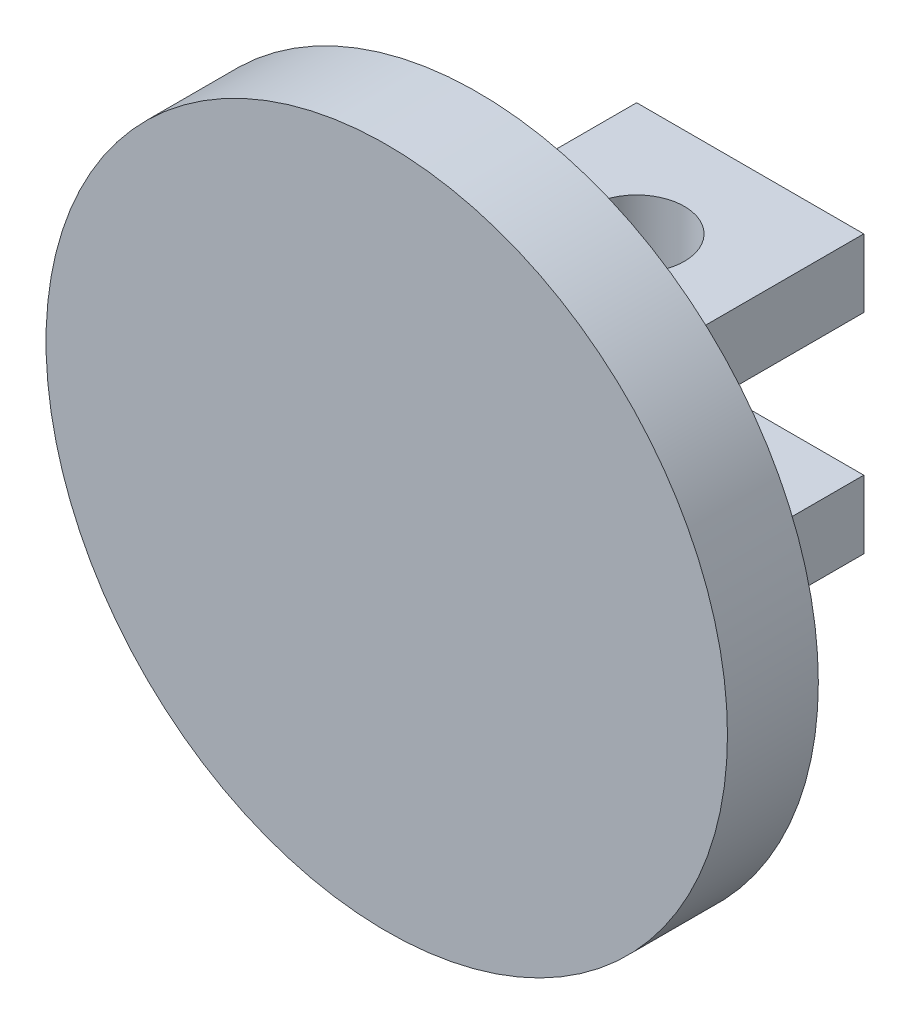
ISO-10303-21;
HEADER;
FILE_DESCRIPTION(('STEP AP214'),'2;1');
FILE_NAME('part.step','',(''),(''),'','','');
FILE_SCHEMA(('AUTOMOTIVE_DESIGN { 1 0 10303 214 1 1 1 1 }'));
ENDSEC;
DATA;
#1=APPLICATION_CONTEXT('core data for automotive mechanical design processes');
#2=APPLICATION_PROTOCOL_DEFINITION('international standard','automotive_design',2000,#1);
#3=PRODUCT_CONTEXT('',#1,'mechanical');
#4=PRODUCT('Part','Part','',(#3));
#5=PRODUCT_RELATED_PRODUCT_CATEGORY('part','',(#4));
#6=PRODUCT_DEFINITION_FORMATION('','',#4);
#7=PRODUCT_DEFINITION_CONTEXT('part definition',#1,'design');
#8=PRODUCT_DEFINITION('design','',#6,#7);
#9=PRODUCT_DEFINITION_SHAPE('','',#8);
#10=(LENGTH_UNIT() NAMED_UNIT(*) SI_UNIT(.MILLI.,.METRE.));
#11=(NAMED_UNIT(*) PLANE_ANGLE_UNIT() SI_UNIT($,.RADIAN.));
#12=(NAMED_UNIT(*) SI_UNIT($,.STERADIAN.) SOLID_ANGLE_UNIT());
#13=UNCERTAINTY_MEASURE_WITH_UNIT(LENGTH_MEASURE(1.E-05),#10,'distance_accuracy_value','');
#14=(GEOMETRIC_REPRESENTATION_CONTEXT(3) GLOBAL_UNCERTAINTY_ASSIGNED_CONTEXT((#13)) GLOBAL_UNIT_ASSIGNED_CONTEXT((#10,
#11,#12)) REPRESENTATION_CONTEXT('',''));
#15=CARTESIAN_POINT('',(0.,0.,0.));
#16=DIRECTION('',(0.,0.,1.));
#17=DIRECTION('',(1.,0.,0.));
#18=AXIS2_PLACEMENT_3D('',#15,#16,#17);
#19=CARTESIAN_POINT('',(0.,0.,4.));
#20=DIRECTION('',(0.,0.,-1.));
#21=DIRECTION('',(-1.,0.,0.));
#22=AXIS2_PLACEMENT_3D('',#19,#20,#21);
#23=CYLINDRICAL_SURFACE('',#22,15.);
#24=CARTESIAN_POINT('',(0.,0.,4.));
#25=DIRECTION('',(0.,0.,1.));
#26=DIRECTION('',(1.,0.,0.));
#27=AXIS2_PLACEMENT_3D('',#24,#25,#26);
#28=CIRCLE('',#27,15.);
#29=CARTESIAN_POINT('',(15.,0.,4.));
#30=VERTEX_POINT('',#29);
#31=EDGE_CURVE('E11',#30,#30,#28,.T.);
#32=ORIENTED_EDGE('',*,*,#31,.F.);
#33=EDGE_LOOP('',(#32));
#34=FACE_BOUND('',#33,.T.);
#35=CARTESIAN_POINT('',(0.,0.,0.));
#36=DIRECTION('',(0.,0.,1.));
#37=DIRECTION('',(1.,0.,0.));
#38=AXIS2_PLACEMENT_3D('',#35,#36,#37);
#39=CIRCLE('',#38,15.);
#40=CARTESIAN_POINT('',(15.,0.,0.));
#41=VERTEX_POINT('',#40);
#42=EDGE_CURVE('E45',#41,#41,#39,.T.);
#43=ORIENTED_EDGE('',*,*,#42,.T.);
#44=EDGE_LOOP('',(#43));
#45=FACE_BOUND('',#44,.T.);
#46=ADVANCED_FACE('F37',(#34,#45),#23,.T.);
#47=CARTESIAN_POINT('',(0.,0.,4.));
#48=DIRECTION('',(0.,0.,1.));
#49=DIRECTION('',(1.,0.,0.));
#50=AXIS2_PLACEMENT_3D('',#47,#48,#49);
#51=PLANE('',#50);
#52=ORIENTED_EDGE('',*,*,#31,.T.);
#53=EDGE_LOOP('',(#52));
#54=FACE_BOUND('',#53,.T.);
#55=ADVANCED_FACE('F176',(#54),#51,.T.);
#56=CARTESIAN_POINT('',(0.,0.,0.));
#57=DIRECTION('',(0.,0.,1.));
#58=DIRECTION('',(1.,0.,0.));
#59=AXIS2_PLACEMENT_3D('',#56,#57,#58);
#60=PLANE('',#59);
#61=DIRECTION('',(-1.,0.,0.));
#62=VECTOR('',#61,1.);
#63=CARTESIAN_POINT('',(-5.,-3.1,0.));
#64=LINE('',#63,#62);
#65=CARTESIAN_POINT('',(5.,-3.1,0.));
#66=VERTEX_POINT('',#65);
#67=CARTESIAN_POINT('',(-5.,-3.1,0.));
#68=VERTEX_POINT('',#67);
#69=EDGE_CURVE('E107',#66,#68,#64,.T.);
#70=ORIENTED_EDGE('',*,*,#69,.T.);
#71=DIRECTION('',(0.,-1.,0.));
#72=VECTOR('',#71,1.);
#73=CARTESIAN_POINT('',(-5.,-6.1,0.));
#74=LINE('',#73,#72);
#75=CARTESIAN_POINT('',(-5.,-6.1,0.));
#76=VERTEX_POINT('',#75);
#77=EDGE_CURVE('E117',#68,#76,#74,.T.);
#78=ORIENTED_EDGE('',*,*,#77,.T.);
#79=DIRECTION('',(1.,0.,0.));
#80=VECTOR('',#79,1.);
#81=CARTESIAN_POINT('',(-5.,-6.1,0.));
#82=LINE('',#81,#80);
#83=CARTESIAN_POINT('',(5.,-6.1,0.));
#84=VERTEX_POINT('',#83);
#85=EDGE_CURVE('E124',#76,#84,#82,.T.);
#86=ORIENTED_EDGE('',*,*,#85,.T.);
#87=DIRECTION('',(0.,1.,0.));
#88=VECTOR('',#87,1.);
#89=CARTESIAN_POINT('',(5.,-6.1,0.));
#90=LINE('',#89,#88);
#91=EDGE_CURVE('E53',#84,#66,#90,.T.);
#92=ORIENTED_EDGE('',*,*,#91,.T.);
#93=EDGE_LOOP('',(#70,#78,#86,#92));
#94=FACE_BOUND('',#93,.T.);
#95=DIRECTION('',(1.,0.,0.));
#96=VECTOR('',#95,1.);
#97=CARTESIAN_POINT('',(-5.,3.1,0.));
#98=LINE('',#97,#96);
#99=CARTESIAN_POINT('',(-5.,3.1,0.));
#100=VERTEX_POINT('',#99);
#101=CARTESIAN_POINT('',(5.,3.1,0.));
#102=VERTEX_POINT('',#101);
#103=EDGE_CURVE('E146',#100,#102,#98,.T.);
#104=ORIENTED_EDGE('',*,*,#103,.T.);
#105=DIRECTION('',(0.,1.,0.));
#106=VECTOR('',#105,1.);
#107=CARTESIAN_POINT('',(5.,6.1,0.));
#108=LINE('',#107,#106);
#109=CARTESIAN_POINT('',(5.,6.1,0.));
#110=VERTEX_POINT('',#109);
#111=EDGE_CURVE('E123',#102,#110,#108,.T.);
#112=ORIENTED_EDGE('',*,*,#111,.T.);
#113=DIRECTION('',(-1.,0.,0.));
#114=VECTOR('',#113,1.);
#115=CARTESIAN_POINT('',(-5.,6.1,0.));
#116=LINE('',#115,#114);
#117=CARTESIAN_POINT('',(-5.,6.1,0.));
#118=VERTEX_POINT('',#117);
#119=EDGE_CURVE('E158',#110,#118,#116,.T.);
#120=ORIENTED_EDGE('',*,*,#119,.T.);
#121=DIRECTION('',(0.,-1.,0.));
#122=VECTOR('',#121,1.);
#123=CARTESIAN_POINT('',(-5.,6.1,0.));
#124=LINE('',#123,#122);
#125=EDGE_CURVE('E61',#118,#100,#124,.T.);
#126=ORIENTED_EDGE('',*,*,#125,.T.);
#127=EDGE_LOOP('',(#104,#112,#120,#126));
#128=FACE_BOUND('',#127,.T.);
#129=ORIENTED_EDGE('',*,*,#42,.F.);
#130=EDGE_LOOP('',(#129));
#131=FACE_BOUND('',#130,.T.);
#132=ADVANCED_FACE('F126',(#94,#128,#131),#60,.F.);
#133=CARTESIAN_POINT('',(5.,6.1,-12.));
#134=DIRECTION('',(1.,0.,0.));
#135=DIRECTION('',(0.,1.,0.));
#136=AXIS2_PLACEMENT_3D('',#133,#134,#135);
#137=PLANE('',#136);
#138=ORIENTED_EDGE('',*,*,#111,.F.);
#139=DIRECTION('',(0.,0.,1.));
#140=VECTOR('',#139,1.);
#141=CARTESIAN_POINT('',(5.,3.1,-12.));
#142=LINE('',#141,#140);
#143=CARTESIAN_POINT('',(5.,3.1,-12.));
#144=VERTEX_POINT('',#143);
#145=EDGE_CURVE('E164',#144,#102,#142,.T.);
#146=ORIENTED_EDGE('',*,*,#145,.F.);
#147=DIRECTION('',(0.,1.,0.));
#148=VECTOR('',#147,1.);
#149=CARTESIAN_POINT('',(5.,6.1,-12.));
#150=LINE('',#149,#148);
#151=CARTESIAN_POINT('',(5.,6.1,-12.));
#152=VERTEX_POINT('',#151);
#153=EDGE_CURVE('E142',#144,#152,#150,.T.);
#154=ORIENTED_EDGE('',*,*,#153,.T.);
#155=DIRECTION('',(0.,0.,1.));
#156=VECTOR('',#155,1.);
#157=CARTESIAN_POINT('',(5.,6.1,-12.));
#158=LINE('',#157,#156);
#159=EDGE_CURVE('E155',#152,#110,#158,.T.);
#160=ORIENTED_EDGE('',*,*,#159,.T.);
#161=EDGE_LOOP('',(#138,#146,#154,#160));
#162=FACE_BOUND('',#161,.T.);
#163=ADVANCED_FACE('F175',(#162),#137,.T.);
#164=CARTESIAN_POINT('',(-5.,3.1,-12.));
#165=DIRECTION('',(0.,-1.,0.));
#166=DIRECTION('',(0.,0.,-1.));
#167=AXIS2_PLACEMENT_3D('',#164,#165,#166);
#168=PLANE('',#167);
#169=CARTESIAN_POINT('',(0.,3.1,-7.));
#170=DIRECTION('',(0.,-1.,0.));
#171=DIRECTION('',(0.,0.,-1.));
#172=AXIS2_PLACEMENT_3D('',#169,#170,#171);
#173=CIRCLE('',#172,2.1);
#174=CARTESIAN_POINT('',(0.,3.1,-9.1));
#175=VERTEX_POINT('',#174);
#176=EDGE_CURVE('E114',#175,#175,#173,.T.);
#177=ORIENTED_EDGE('',*,*,#176,.F.);
#178=EDGE_LOOP('',(#177));
#179=FACE_BOUND('',#178,.T.);
#180=ORIENTED_EDGE('',*,*,#103,.F.);
#181=DIRECTION('',(0.,0.,1.));
#182=VECTOR('',#181,1.);
#183=CARTESIAN_POINT('',(-5.,3.1,-12.));
#184=LINE('',#183,#182);
#185=CARTESIAN_POINT('',(-5.,3.1,-12.));
#186=VERTEX_POINT('',#185);
#187=EDGE_CURVE('E166',#186,#100,#184,.T.);
#188=ORIENTED_EDGE('',*,*,#187,.F.);
#189=DIRECTION('',(1.,0.,0.));
#190=VECTOR('',#189,1.);
#191=CARTESIAN_POINT('',(-5.,3.1,-12.));
#192=LINE('',#191,#190);
#193=EDGE_CURVE('E152',#186,#144,#192,.T.);
#194=ORIENTED_EDGE('',*,*,#193,.T.);
#195=ORIENTED_EDGE('',*,*,#145,.T.);
#196=EDGE_LOOP('',(#180,#188,#194,#195));
#197=FACE_BOUND('',#196,.T.);
#198=ADVANCED_FACE('F181',(#179,#197),#168,.T.);
#199=CARTESIAN_POINT('',(-5.,6.1,-12.));
#200=DIRECTION('',(-1.,0.,0.));
#201=DIRECTION('',(0.,-1.,0.));
#202=AXIS2_PLACEMENT_3D('',#199,#200,#201);
#203=PLANE('',#202);
#204=ORIENTED_EDGE('',*,*,#125,.F.);
#205=DIRECTION('',(0.,0.,1.));
#206=VECTOR('',#205,1.);
#207=CARTESIAN_POINT('',(-5.,6.1,-12.));
#208=LINE('',#207,#206);
#209=CARTESIAN_POINT('',(-5.,6.1,-12.));
#210=VERTEX_POINT('',#209);
#211=EDGE_CURVE('E168',#210,#118,#208,.T.);
#212=ORIENTED_EDGE('',*,*,#211,.F.);
#213=DIRECTION('',(0.,-1.,0.));
#214=VECTOR('',#213,1.);
#215=CARTESIAN_POINT('',(-5.,6.1,-12.));
#216=LINE('',#215,#214);
#217=EDGE_CURVE('E149',#210,#186,#216,.T.);
#218=ORIENTED_EDGE('',*,*,#217,.T.);
#219=ORIENTED_EDGE('',*,*,#187,.T.);
#220=EDGE_LOOP('',(#204,#212,#218,#219));
#221=FACE_BOUND('',#220,.T.);
#222=ADVANCED_FACE('F215',(#221),#203,.T.);
#223=CARTESIAN_POINT('',(-5.,6.1,-12.));
#224=DIRECTION('',(0.,1.,0.));
#225=DIRECTION('',(0.,0.,1.));
#226=AXIS2_PLACEMENT_3D('',#223,#224,#225);
#227=PLANE('',#226);
#228=CARTESIAN_POINT('',(0.,6.1,-7.));
#229=DIRECTION('',(0.,1.,0.));
#230=DIRECTION('',(0.,0.,1.));
#231=AXIS2_PLACEMENT_3D('',#228,#229,#230);
#232=CIRCLE('',#231,2.1);
#233=CARTESIAN_POINT('',(0.,6.1,-4.9));
#234=VERTEX_POINT('',#233);
#235=EDGE_CURVE('E349',#234,#234,#232,.T.);
#236=ORIENTED_EDGE('',*,*,#235,.F.);
#237=EDGE_LOOP('',(#236));
#238=FACE_BOUND('',#237,.T.);
#239=ORIENTED_EDGE('',*,*,#119,.F.);
#240=ORIENTED_EDGE('',*,*,#159,.F.);
#241=DIRECTION('',(-1.,0.,0.));
#242=VECTOR('',#241,1.);
#243=CARTESIAN_POINT('',(-5.,6.1,-12.));
#244=LINE('',#243,#242);
#245=EDGE_CURVE('E145',#152,#210,#244,.T.);
#246=ORIENTED_EDGE('',*,*,#245,.T.);
#247=ORIENTED_EDGE('',*,*,#211,.T.);
#248=EDGE_LOOP('',(#239,#240,#246,#247));
#249=FACE_BOUND('',#248,.T.);
#250=ADVANCED_FACE('F220',(#238,#249),#227,.T.);
#251=CARTESIAN_POINT('',(0.,0.,-12.));
#252=DIRECTION('',(0.,0.,1.));
#253=DIRECTION('',(1.,0.,0.));
#254=AXIS2_PLACEMENT_3D('',#251,#252,#253);
#255=PLANE('',#254);
#256=ORIENTED_EDGE('',*,*,#153,.F.);
#257=ORIENTED_EDGE('',*,*,#193,.F.);
#258=ORIENTED_EDGE('',*,*,#217,.F.);
#259=ORIENTED_EDGE('',*,*,#245,.F.);
#260=EDGE_LOOP('',(#256,#257,#258,#259));
#261=FACE_BOUND('',#260,.T.);
#262=ADVANCED_FACE('F228',(#261),#255,.F.);
#263=CARTESIAN_POINT('',(-5.,-6.1,-12.));
#264=DIRECTION('',(-1.,0.,0.));
#265=DIRECTION('',(0.,-1.,0.));
#266=AXIS2_PLACEMENT_3D('',#263,#264,#265);
#267=PLANE('',#266);
#268=ORIENTED_EDGE('',*,*,#77,.F.);
#269=DIRECTION('',(0.,0.,1.));
#270=VECTOR('',#269,1.);
#271=CARTESIAN_POINT('',(-5.,-3.1,-12.));
#272=LINE('',#271,#270);
#273=CARTESIAN_POINT('',(-5.,-3.1,-12.));
#274=VERTEX_POINT('',#273);
#275=EDGE_CURVE('E103',#274,#68,#272,.T.);
#276=ORIENTED_EDGE('',*,*,#275,.F.);
#277=DIRECTION('',(0.,-1.,0.));
#278=VECTOR('',#277,1.);
#279=CARTESIAN_POINT('',(-5.,-6.1,-12.));
#280=LINE('',#279,#278);
#281=CARTESIAN_POINT('',(-5.,-6.1,-12.));
#282=VERTEX_POINT('',#281);
#283=EDGE_CURVE('E128',#274,#282,#280,.T.);
#284=ORIENTED_EDGE('',*,*,#283,.T.);
#285=DIRECTION('',(0.,0.,1.));
#286=VECTOR('',#285,1.);
#287=CARTESIAN_POINT('',(-5.,-6.1,-12.));
#288=LINE('',#287,#286);
#289=EDGE_CURVE('E119',#282,#76,#288,.T.);
#290=ORIENTED_EDGE('',*,*,#289,.T.);
#291=EDGE_LOOP('',(#268,#276,#284,#290));
#292=FACE_BOUND('',#291,.T.);
#293=ADVANCED_FACE('F118',(#292),#267,.T.);
#294=CARTESIAN_POINT('',(-5.,-3.1,-12.));
#295=DIRECTION('',(0.,1.,0.));
#296=DIRECTION('',(0.,0.,1.));
#297=AXIS2_PLACEMENT_3D('',#294,#295,#296);
#298=PLANE('',#297);
#299=CARTESIAN_POINT('',(0.,-3.1,-7.));
#300=DIRECTION('',(0.,1.,0.));
#301=DIRECTION('',(0.,0.,1.));
#302=AXIS2_PLACEMENT_3D('',#299,#300,#301);
#303=CIRCLE('',#302,2.1);
#304=CARTESIAN_POINT('',(0.,-3.1,-4.9));
#305=VERTEX_POINT('',#304);
#306=EDGE_CURVE('E352',#305,#305,#303,.T.);
#307=ORIENTED_EDGE('',*,*,#306,.F.);
#308=EDGE_LOOP('',(#307));
#309=FACE_BOUND('',#308,.T.);
#310=ORIENTED_EDGE('',*,*,#69,.F.);
#311=DIRECTION('',(0.,0.,1.));
#312=VECTOR('',#311,1.);
#313=CARTESIAN_POINT('',(5.,-3.1,-12.));
#314=LINE('',#313,#312);
#315=CARTESIAN_POINT('',(5.,-3.1,-12.));
#316=VERTEX_POINT('',#315);
#317=EDGE_CURVE('E113',#316,#66,#314,.T.);
#318=ORIENTED_EDGE('',*,*,#317,.F.);
#319=DIRECTION('',(-1.,0.,0.));
#320=VECTOR('',#319,1.);
#321=CARTESIAN_POINT('',(-5.,-3.1,-12.));
#322=LINE('',#321,#320);
#323=EDGE_CURVE('E109',#316,#274,#322,.T.);
#324=ORIENTED_EDGE('',*,*,#323,.T.);
#325=ORIENTED_EDGE('',*,*,#275,.T.);
#326=EDGE_LOOP('',(#310,#318,#324,#325));
#327=FACE_BOUND('',#326,.T.);
#328=ADVANCED_FACE('F105',(#309,#327),#298,.T.);
#329=CARTESIAN_POINT('',(5.,-6.1,-12.));
#330=DIRECTION('',(1.,0.,0.));
#331=DIRECTION('',(0.,1.,0.));
#332=AXIS2_PLACEMENT_3D('',#329,#330,#331);
#333=PLANE('',#332);
#334=ORIENTED_EDGE('',*,*,#91,.F.);
#335=DIRECTION('',(0.,0.,1.));
#336=VECTOR('',#335,1.);
#337=CARTESIAN_POINT('',(5.,-6.1,-12.));
#338=LINE('',#337,#336);
#339=CARTESIAN_POINT('',(5.,-6.1,-12.));
#340=VERTEX_POINT('',#339);
#341=EDGE_CURVE('E358',#340,#84,#338,.T.);
#342=ORIENTED_EDGE('',*,*,#341,.F.);
#343=DIRECTION('',(0.,1.,0.));
#344=VECTOR('',#343,1.);
#345=CARTESIAN_POINT('',(5.,-6.1,-12.));
#346=LINE('',#345,#344);
#347=EDGE_CURVE('E137',#340,#316,#346,.T.);
#348=ORIENTED_EDGE('',*,*,#347,.T.);
#349=ORIENTED_EDGE('',*,*,#317,.T.);
#350=EDGE_LOOP('',(#334,#342,#348,#349));
#351=FACE_BOUND('',#350,.T.);
#352=ADVANCED_FACE('F250',(#351),#333,.T.);
#353=CARTESIAN_POINT('',(-5.,-6.1,-12.));
#354=DIRECTION('',(0.,-1.,0.));
#355=DIRECTION('',(0.,0.,-1.));
#356=AXIS2_PLACEMENT_3D('',#353,#354,#355);
#357=PLANE('',#356);
#358=CARTESIAN_POINT('',(0.,-6.1,-7.));
#359=DIRECTION('',(0.,-1.,0.));
#360=DIRECTION('',(0.,0.,-1.));
#361=AXIS2_PLACEMENT_3D('',#358,#359,#360);
#362=CIRCLE('',#361,2.1);
#363=CARTESIAN_POINT('',(0.,-6.1,-9.1));
#364=VERTEX_POINT('',#363);
#365=EDGE_CURVE('E40',#364,#364,#362,.T.);
#366=ORIENTED_EDGE('',*,*,#365,.F.);
#367=EDGE_LOOP('',(#366));
#368=FACE_BOUND('',#367,.T.);
#369=ORIENTED_EDGE('',*,*,#85,.F.);
#370=ORIENTED_EDGE('',*,*,#289,.F.);
#371=DIRECTION('',(1.,0.,0.));
#372=VECTOR('',#371,1.);
#373=CARTESIAN_POINT('',(-5.,-6.1,-12.));
#374=LINE('',#373,#372);
#375=EDGE_CURVE('E131',#282,#340,#374,.T.);
#376=ORIENTED_EDGE('',*,*,#375,.T.);
#377=ORIENTED_EDGE('',*,*,#341,.T.);
#378=EDGE_LOOP('',(#369,#370,#376,#377));
#379=FACE_BOUND('',#378,.T.);
#380=ADVANCED_FACE('F255',(#368,#379),#357,.T.);
#381=CARTESIAN_POINT('',(0.,0.,-12.));
#382=DIRECTION('',(0.,0.,-1.));
#383=DIRECTION('',(-1.,0.,0.));
#384=AXIS2_PLACEMENT_3D('',#381,#382,#383);
#385=PLANE('',#384);
#386=ORIENTED_EDGE('',*,*,#283,.F.);
#387=ORIENTED_EDGE('',*,*,#323,.F.);
#388=ORIENTED_EDGE('',*,*,#347,.F.);
#389=ORIENTED_EDGE('',*,*,#375,.F.);
#390=EDGE_LOOP('',(#386,#387,#388,#389));
#391=FACE_BOUND('',#390,.T.);
#392=ADVANCED_FACE('F263',(#391),#385,.T.);
#393=CARTESIAN_POINT('',(0.,-9.9,-7.));
#394=DIRECTION('',(0.,1.,0.));
#395=DIRECTION('',(0.,0.,1.));
#396=AXIS2_PLACEMENT_3D('',#393,#394,#395);
#397=CYLINDRICAL_SURFACE('',#396,2.1);
#398=ORIENTED_EDGE('',*,*,#306,.T.);
#399=EDGE_LOOP('',(#398));
#400=FACE_BOUND('',#399,.T.);
#401=ORIENTED_EDGE('',*,*,#365,.T.);
#402=EDGE_LOOP('',(#401));
#403=FACE_BOUND('',#402,.T.);
#404=ADVANCED_FACE('F268',(#400,#403),#397,.F.);
#405=ORIENTED_EDGE('',*,*,#176,.T.);
#406=EDGE_LOOP('',(#405));
#407=FACE_BOUND('',#406,.T.);
#408=ORIENTED_EDGE('',*,*,#235,.T.);
#409=EDGE_LOOP('',(#408));
#410=FACE_BOUND('',#409,.T.);
#411=ADVANCED_FACE('F311',(#407,#410),#397,.F.);
#412=CLOSED_SHELL('',(#46,#55,#132,#163,#198,#222,#250,#262,#293,#328,#352,#380,#392,#404,#411));
#413=MANIFOLD_SOLID_BREP('B2',#412);
#414=ADVANCED_BREP_SHAPE_REPRESENTATION('',(#18,#413),#14);
#415=SHAPE_DEFINITION_REPRESENTATION(#9,#414);
ENDSEC;
END-ISO-10303-21;
